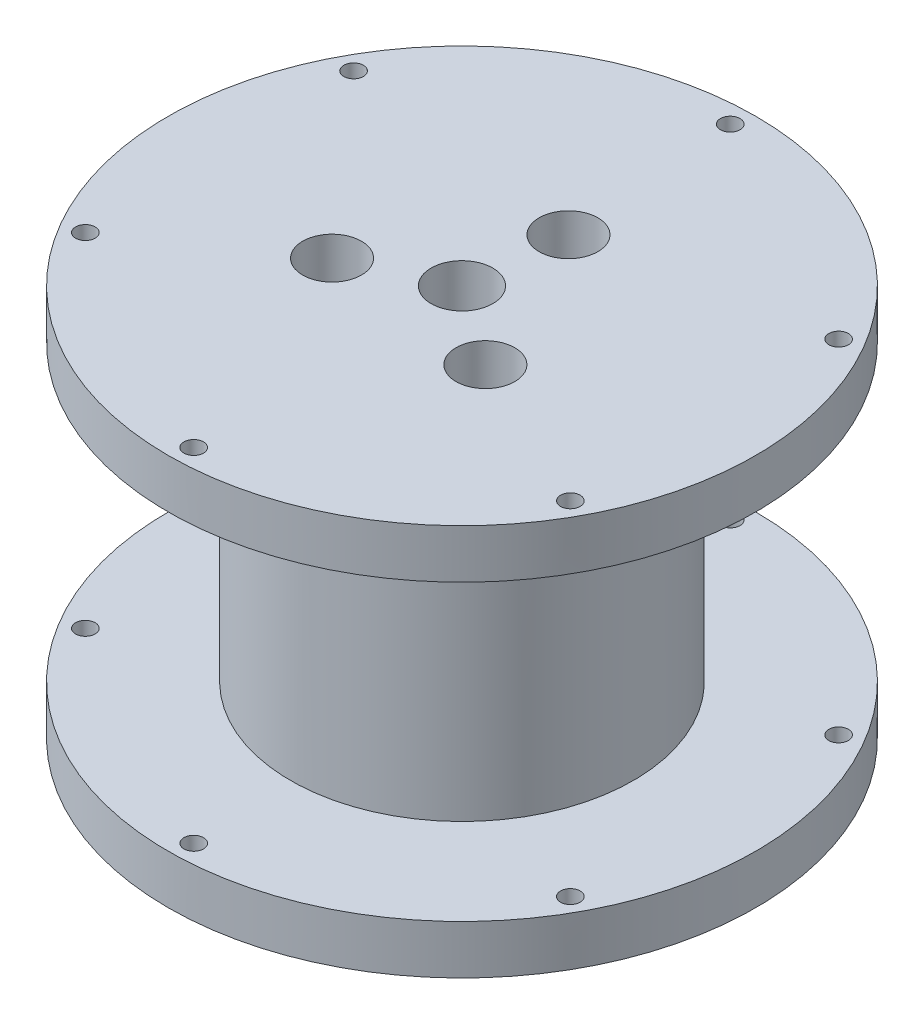
ISO-10303-21;
HEADER;
FILE_DESCRIPTION(('STEP AP214'),'2;1');
FILE_NAME('part.step','',(''),(''),'','','');
FILE_SCHEMA(('AUTOMOTIVE_DESIGN { 1 0 10303 214 1 1 1 1 }'));
ENDSEC;
DATA;
#1=APPLICATION_CONTEXT('core data for automotive mechanical design processes');
#2=APPLICATION_PROTOCOL_DEFINITION('international standard','automotive_design',2000,#1);
#3=PRODUCT_CONTEXT('',#1,'mechanical');
#4=PRODUCT('Part','Part','',(#3));
#5=PRODUCT_RELATED_PRODUCT_CATEGORY('part','',(#4));
#6=PRODUCT_DEFINITION_FORMATION('','',#4);
#7=PRODUCT_DEFINITION_CONTEXT('part definition',#1,'design');
#8=PRODUCT_DEFINITION('design','',#6,#7);
#9=PRODUCT_DEFINITION_SHAPE('','',#8);
#10=(LENGTH_UNIT() NAMED_UNIT(*) SI_UNIT(.MILLI.,.METRE.));
#11=(NAMED_UNIT(*) PLANE_ANGLE_UNIT() SI_UNIT($,.RADIAN.));
#12=(NAMED_UNIT(*) SI_UNIT($,.STERADIAN.) SOLID_ANGLE_UNIT());
#13=UNCERTAINTY_MEASURE_WITH_UNIT(LENGTH_MEASURE(1.E-05),#10,'distance_accuracy_value','');
#14=(GEOMETRIC_REPRESENTATION_CONTEXT(3) GLOBAL_UNCERTAINTY_ASSIGNED_CONTEXT((#13)) GLOBAL_UNIT_ASSIGNED_CONTEXT((#10,
#11,#12)) REPRESENTATION_CONTEXT('',''));
#15=CARTESIAN_POINT('',(0.,0.,0.));
#16=DIRECTION('',(0.,0.,1.));
#17=DIRECTION('',(1.,0.,0.));
#18=AXIS2_PLACEMENT_3D('',#15,#16,#17);
#19=CARTESIAN_POINT('',(0.,40.,0.));
#20=DIRECTION('',(0.,-1.,0.));
#21=DIRECTION('',(0.,0.,-1.));
#22=AXIS2_PLACEMENT_3D('',#19,#20,#21);
#23=CYLINDRICAL_SURFACE('',#22,3.15);
#24=CARTESIAN_POINT('',(0.,40.,0.));
#25=DIRECTION('',(0.,-1.,0.));
#26=DIRECTION('',(0.,0.,-1.));
#27=AXIS2_PLACEMENT_3D('',#24,#25,#26);
#28=CIRCLE('',#27,3.15);
#29=CARTESIAN_POINT('',(0.,40.,-3.15));
#30=VERTEX_POINT('',#29);
#31=EDGE_CURVE('E179',#30,#30,#28,.T.);
#32=ORIENTED_EDGE('',*,*,#31,.F.);
#33=EDGE_LOOP('',(#32));
#34=FACE_BOUND('',#33,.T.);
#35=CARTESIAN_POINT('',(0.,7.5,0.));
#36=DIRECTION('',(0.,-1.,0.));
#37=DIRECTION('',(0.,0.,-1.));
#38=AXIS2_PLACEMENT_3D('',#35,#36,#37);
#39=CIRCLE('',#38,3.15);
#40=CARTESIAN_POINT('',(0.,7.5,-3.15));
#41=VERTEX_POINT('',#40);
#42=EDGE_CURVE('E157',#41,#41,#39,.F.);
#43=ORIENTED_EDGE('',*,*,#42,.F.);
#44=EDGE_LOOP('',(#43));
#45=FACE_BOUND('',#44,.T.);
#46=ADVANCED_FACE('F34',(#34,#45),#23,.F.);
#47=CARTESIAN_POINT('',(0.,40.,0.));
#48=DIRECTION('',(0.,-1.,0.));
#49=DIRECTION('',(0.,0.,-1.));
#50=AXIS2_PLACEMENT_3D('',#47,#48,#49);
#51=CYLINDRICAL_SURFACE('',#50,30.);
#52=CARTESIAN_POINT('',(0.,40.,0.));
#53=DIRECTION('',(0.,1.,0.));
#54=DIRECTION('',(0.,0.,1.));
#55=AXIS2_PLACEMENT_3D('',#52,#53,#54);
#56=CIRCLE('',#55,30.);
#57=CARTESIAN_POINT('',(0.,40.,30.));
#58=VERTEX_POINT('',#57);
#59=EDGE_CURVE('E203',#58,#58,#56,.T.);
#60=ORIENTED_EDGE('',*,*,#59,.F.);
#61=EDGE_LOOP('',(#60));
#62=FACE_BOUND('',#61,.T.);
#63=CARTESIAN_POINT('',(0.,35.,0.));
#64=DIRECTION('',(0.,-1.,0.));
#65=DIRECTION('',(0.,0.,-1.));
#66=AXIS2_PLACEMENT_3D('',#63,#64,#65);
#67=CIRCLE('',#66,30.);
#68=CARTESIAN_POINT('',(0.,35.,-30.));
#69=VERTEX_POINT('',#68);
#70=EDGE_CURVE('E210',#69,#69,#67,.T.);
#71=ORIENTED_EDGE('',*,*,#70,.F.);
#72=EDGE_LOOP('',(#71));
#73=FACE_BOUND('',#72,.T.);
#74=ADVANCED_FACE('F247',(#62,#73),#51,.T.);
#75=CARTESIAN_POINT('',(0.,40.,0.));
#76=DIRECTION('',(0.,1.,0.));
#77=DIRECTION('',(0.,0.,1.));
#78=AXIS2_PLACEMENT_3D('',#75,#76,#77);
#79=PLANE('',#78);
#80=CARTESIAN_POINT('',(23.9426736674736,40.,-14.517175264247));
#81=DIRECTION('',(0.,-1.,0.));
#82=DIRECTION('',(0.,0.,-1.));
#83=AXIS2_PLACEMENT_3D('',#80,#81,#82);
#84=CIRCLE('',#83,1.);
#85=CARTESIAN_POINT('',(23.9426736674736,40.,-15.517175264247));
#86=VERTEX_POINT('',#85);
#87=EDGE_CURVE('E497',#86,#86,#84,.T.);
#88=ORIENTED_EDGE('',*,*,#87,.T.);
#89=EDGE_LOOP('',(#88));
#90=FACE_BOUND('',#89,.T.);
#91=CARTESIAN_POINT('',(-0.600905736292166,40.,-27.9935512626764));
#92=DIRECTION('',(0.,-1.,0.));
#93=DIRECTION('',(0.,0.,-1.));
#94=AXIS2_PLACEMENT_3D('',#91,#92,#93);
#95=CIRCLE('',#94,1.);
#96=CARTESIAN_POINT('',(-0.600905736292166,40.,-28.9935512626764));
#97=VERTEX_POINT('',#96);
#98=EDGE_CURVE('E498',#97,#97,#95,.T.);
#99=ORIENTED_EDGE('',*,*,#98,.T.);
#100=EDGE_LOOP('',(#99));
#101=FACE_BOUND('',#100,.T.);
#102=CARTESIAN_POINT('',(-24.5435794037658,40.,-13.4763759984294));
#103=DIRECTION('',(0.,-1.,0.));
#104=DIRECTION('',(0.,0.,-1.));
#105=AXIS2_PLACEMENT_3D('',#102,#103,#104);
#106=CIRCLE('',#105,1.);
#107=CARTESIAN_POINT('',(-24.5435794037658,40.,-14.4763759984294));
#108=VERTEX_POINT('',#107);
#109=EDGE_CURVE('E501',#108,#108,#106,.T.);
#110=ORIENTED_EDGE('',*,*,#109,.T.);
#111=EDGE_LOOP('',(#110));
#112=FACE_BOUND('',#111,.T.);
#113=CARTESIAN_POINT('',(-23.9426736674736,40.,14.517175264247));
#114=DIRECTION('',(0.,-1.,0.));
#115=DIRECTION('',(0.,0.,-1.));
#116=AXIS2_PLACEMENT_3D('',#113,#114,#115);
#117=CIRCLE('',#116,1.);
#118=CARTESIAN_POINT('',(-23.9426736674736,40.,13.517175264247));
#119=VERTEX_POINT('',#118);
#120=EDGE_CURVE('E624',#119,#119,#117,.T.);
#121=ORIENTED_EDGE('',*,*,#120,.T.);
#122=EDGE_LOOP('',(#121));
#123=FACE_BOUND('',#122,.T.);
#124=CARTESIAN_POINT('',(0.600905736292153,40.,27.9935512626764));
#125=DIRECTION('',(0.,-1.,0.));
#126=DIRECTION('',(0.,0.,-1.));
#127=AXIS2_PLACEMENT_3D('',#124,#125,#126);
#128=CIRCLE('',#127,1.);
#129=CARTESIAN_POINT('',(0.600905736292153,40.,26.9935512626764));
#130=VERTEX_POINT('',#129);
#131=EDGE_CURVE('E509',#130,#130,#128,.T.);
#132=ORIENTED_EDGE('',*,*,#131,.T.);
#133=EDGE_LOOP('',(#132));
#134=FACE_BOUND('',#133,.T.);
#135=CARTESIAN_POINT('',(24.5435794037658,40.,13.4763759984294));
#136=DIRECTION('',(0.,-1.,0.));
#137=DIRECTION('',(0.,0.,-1.));
#138=AXIS2_PLACEMENT_3D('',#135,#136,#137);
#139=CIRCLE('',#138,1.);
#140=CARTESIAN_POINT('',(24.5435794037658,40.,12.4763759984294));
#141=VERTEX_POINT('',#140);
#142=EDGE_CURVE('E505',#141,#141,#139,.T.);
#143=ORIENTED_EDGE('',*,*,#142,.T.);
#144=EDGE_LOOP('',(#143));
#145=FACE_BOUND('',#144,.T.);
#146=CARTESIAN_POINT('',(0.91840979877331,40.,-9.95773686344027));
#147=DIRECTION('',(0.,-1.,0.));
#148=DIRECTION('',(0.,0.,-1.));
#149=AXIS2_PLACEMENT_3D('',#146,#147,#148);
#150=CIRCLE('',#149,3.);
#151=CARTESIAN_POINT('',(0.91840979877331,40.,-12.9577368634403));
#152=VERTEX_POINT('',#151);
#153=EDGE_CURVE('E176',#152,#152,#150,.T.);
#154=ORIENTED_EDGE('',*,*,#153,.T.);
#155=EDGE_LOOP('',(#154));
#156=FACE_BOUND('',#155,.T.);
#157=CARTESIAN_POINT('',(8.1644481885534,40.,5.77423464854237));
#158=DIRECTION('',(0.,-1.,0.));
#159=DIRECTION('',(0.,0.,-1.));
#160=AXIS2_PLACEMENT_3D('',#157,#158,#159);
#161=CIRCLE('',#160,3.);
#162=CARTESIAN_POINT('',(8.1644481885534,40.,2.77423464854237));
#163=VERTEX_POINT('',#162);
#164=EDGE_CURVE('E183',#163,#163,#161,.T.);
#165=ORIENTED_EDGE('',*,*,#164,.T.);
#166=EDGE_LOOP('',(#165));
#167=FACE_BOUND('',#166,.T.);
#168=CARTESIAN_POINT('',(-9.0828579873267,40.,4.1835022148979));
#169=DIRECTION('',(0.,-1.,0.));
#170=DIRECTION('',(0.,0.,-1.));
#171=AXIS2_PLACEMENT_3D('',#168,#169,#170);
#172=CIRCLE('',#171,3.);
#173=CARTESIAN_POINT('',(-9.0828579873267,40.,1.1835022148979));
#174=VERTEX_POINT('',#173);
#175=EDGE_CURVE('E189',#174,#174,#172,.T.);
#176=ORIENTED_EDGE('',*,*,#175,.T.);
#177=EDGE_LOOP('',(#176));
#178=FACE_BOUND('',#177,.T.);
#179=ORIENTED_EDGE('',*,*,#31,.T.);
#180=EDGE_LOOP('',(#179));
#181=FACE_BOUND('',#180,.T.);
#182=ORIENTED_EDGE('',*,*,#59,.T.);
#183=EDGE_LOOP('',(#182));
#184=FACE_BOUND('',#183,.T.);
#185=ADVANCED_FACE('F240',(#90,#101,#112,#123,#134,#145,#156,#167,#178,#181,#184),#79,.T.);
#186=CARTESIAN_POINT('',(0.,35.,0.));
#187=DIRECTION('',(0.,-1.,0.));
#188=DIRECTION('',(0.,0.,-1.));
#189=AXIS2_PLACEMENT_3D('',#186,#187,#188);
#190=PLANE('',#189);
#191=CARTESIAN_POINT('',(23.9426736674736,35.,-14.517175264247));
#192=DIRECTION('',(0.,-1.,0.));
#193=DIRECTION('',(0.,0.,-1.));
#194=AXIS2_PLACEMENT_3D('',#191,#192,#193);
#195=CIRCLE('',#194,1.);
#196=CARTESIAN_POINT('',(23.9426736674736,35.,-15.517175264247));
#197=VERTEX_POINT('',#196);
#198=EDGE_CURVE('E134',#197,#197,#195,.T.);
#199=ORIENTED_EDGE('',*,*,#198,.F.);
#200=EDGE_LOOP('',(#199));
#201=FACE_BOUND('',#200,.T.);
#202=CARTESIAN_POINT('',(-0.600905736292166,35.,-27.9935512626764));
#203=DIRECTION('',(0.,-1.,0.));
#204=DIRECTION('',(0.,0.,-1.));
#205=AXIS2_PLACEMENT_3D('',#202,#203,#204);
#206=CIRCLE('',#205,1.);
#207=CARTESIAN_POINT('',(-0.600905736292166,35.,-28.9935512626764));
#208=VERTEX_POINT('',#207);
#209=EDGE_CURVE('E541',#208,#208,#206,.T.);
#210=ORIENTED_EDGE('',*,*,#209,.F.);
#211=EDGE_LOOP('',(#210));
#212=FACE_BOUND('',#211,.T.);
#213=CARTESIAN_POINT('',(-24.5435794037658,35.,-13.4763759984294));
#214=DIRECTION('',(0.,-1.,0.));
#215=DIRECTION('',(0.,0.,-1.));
#216=AXIS2_PLACEMENT_3D('',#213,#214,#215);
#217=CIRCLE('',#216,1.);
#218=CARTESIAN_POINT('',(-24.5435794037658,35.,-14.4763759984294));
#219=VERTEX_POINT('',#218);
#220=EDGE_CURVE('E534',#219,#219,#217,.T.);
#221=ORIENTED_EDGE('',*,*,#220,.F.);
#222=EDGE_LOOP('',(#221));
#223=FACE_BOUND('',#222,.T.);
#224=CARTESIAN_POINT('',(-23.9426736674736,35.,14.517175264247));
#225=DIRECTION('',(0.,-1.,0.));
#226=DIRECTION('',(0.,0.,-1.));
#227=AXIS2_PLACEMENT_3D('',#224,#225,#226);
#228=CIRCLE('',#227,1.);
#229=CARTESIAN_POINT('',(-23.9426736674736,35.,13.517175264247));
#230=VERTEX_POINT('',#229);
#231=EDGE_CURVE('E527',#230,#230,#228,.T.);
#232=ORIENTED_EDGE('',*,*,#231,.F.);
#233=EDGE_LOOP('',(#232));
#234=FACE_BOUND('',#233,.T.);
#235=CARTESIAN_POINT('',(0.600905736292153,35.,27.9935512626764));
#236=DIRECTION('',(0.,-1.,0.));
#237=DIRECTION('',(0.,0.,-1.));
#238=AXIS2_PLACEMENT_3D('',#235,#236,#237);
#239=CIRCLE('',#238,1.);
#240=CARTESIAN_POINT('',(0.600905736292153,35.,26.9935512626764));
#241=VERTEX_POINT('',#240);
#242=EDGE_CURVE('E520',#241,#241,#239,.T.);
#243=ORIENTED_EDGE('',*,*,#242,.F.);
#244=EDGE_LOOP('',(#243));
#245=FACE_BOUND('',#244,.T.);
#246=CARTESIAN_POINT('',(24.5435794037658,35.,13.4763759984294));
#247=DIRECTION('',(0.,-1.,0.));
#248=DIRECTION('',(0.,0.,-1.));
#249=AXIS2_PLACEMENT_3D('',#246,#247,#248);
#250=CIRCLE('',#249,1.);
#251=CARTESIAN_POINT('',(24.5435794037658,35.,12.4763759984294));
#252=VERTEX_POINT('',#251);
#253=EDGE_CURVE('E513',#252,#252,#250,.T.);
#254=ORIENTED_EDGE('',*,*,#253,.F.);
#255=EDGE_LOOP('',(#254));
#256=FACE_BOUND('',#255,.T.);
#257=CARTESIAN_POINT('',(0.,35.,0.));
#258=DIRECTION('',(0.,-1.,0.));
#259=DIRECTION('',(0.,0.,-1.));
#260=AXIS2_PLACEMENT_3D('',#257,#258,#259);
#261=CIRCLE('',#260,17.5);
#262=CARTESIAN_POINT('',(0.,35.,-17.5));
#263=VERTEX_POINT('',#262);
#264=EDGE_CURVE('E197',#263,#263,#261,.T.);
#265=ORIENTED_EDGE('',*,*,#264,.F.);
#266=EDGE_LOOP('',(#265));
#267=FACE_BOUND('',#266,.T.);
#268=ORIENTED_EDGE('',*,*,#70,.T.);
#269=EDGE_LOOP('',(#268));
#270=FACE_BOUND('',#269,.T.);
#271=ADVANCED_FACE('F236',(#201,#212,#223,#234,#245,#256,#267,#270),#190,.T.);
#272=CARTESIAN_POINT('',(0.,5.,0.));
#273=DIRECTION('',(0.,-1.,0.));
#274=DIRECTION('',(0.,0.,-1.));
#275=AXIS2_PLACEMENT_3D('',#272,#273,#274);
#276=PLANE('',#275);
#277=CARTESIAN_POINT('',(23.9426736674736,5.,-14.517175264247));
#278=DIRECTION('',(0.,-1.,0.));
#279=DIRECTION('',(0.,0.,-1.));
#280=AXIS2_PLACEMENT_3D('',#277,#278,#279);
#281=CIRCLE('',#280,1.);
#282=CARTESIAN_POINT('',(23.9426736674736,5.,-15.517175264247));
#283=VERTEX_POINT('',#282);
#284=EDGE_CURVE('E543',#283,#283,#281,.T.);
#285=ORIENTED_EDGE('',*,*,#284,.T.);
#286=EDGE_LOOP('',(#285));
#287=FACE_BOUND('',#286,.T.);
#288=CARTESIAN_POINT('',(-0.600905736292166,5.,-27.9935512626764));
#289=DIRECTION('',(0.,-1.,0.));
#290=DIRECTION('',(0.,0.,-1.));
#291=AXIS2_PLACEMENT_3D('',#288,#289,#290);
#292=CIRCLE('',#291,1.);
#293=CARTESIAN_POINT('',(-0.600905736292166,5.,-28.9935512626764));
#294=VERTEX_POINT('',#293);
#295=EDGE_CURVE('E538',#294,#294,#292,.T.);
#296=ORIENTED_EDGE('',*,*,#295,.T.);
#297=EDGE_LOOP('',(#296));
#298=FACE_BOUND('',#297,.T.);
#299=CARTESIAN_POINT('',(-24.5435794037658,5.,-13.4763759984294));
#300=DIRECTION('',(0.,-1.,0.));
#301=DIRECTION('',(0.,0.,-1.));
#302=AXIS2_PLACEMENT_3D('',#299,#300,#301);
#303=CIRCLE('',#302,1.);
#304=CARTESIAN_POINT('',(-24.5435794037658,5.,-14.4763759984294));
#305=VERTEX_POINT('',#304);
#306=EDGE_CURVE('E531',#305,#305,#303,.T.);
#307=ORIENTED_EDGE('',*,*,#306,.T.);
#308=EDGE_LOOP('',(#307));
#309=FACE_BOUND('',#308,.T.);
#310=CARTESIAN_POINT('',(-23.9426736674736,5.,14.517175264247));
#311=DIRECTION('',(0.,-1.,0.));
#312=DIRECTION('',(0.,0.,-1.));
#313=AXIS2_PLACEMENT_3D('',#310,#311,#312);
#314=CIRCLE('',#313,1.);
#315=CARTESIAN_POINT('',(-23.9426736674736,5.,13.517175264247));
#316=VERTEX_POINT('',#315);
#317=EDGE_CURVE('E524',#316,#316,#314,.T.);
#318=ORIENTED_EDGE('',*,*,#317,.T.);
#319=EDGE_LOOP('',(#318));
#320=FACE_BOUND('',#319,.T.);
#321=CARTESIAN_POINT('',(0.600905736292153,5.,27.9935512626764));
#322=DIRECTION('',(0.,-1.,0.));
#323=DIRECTION('',(0.,0.,-1.));
#324=AXIS2_PLACEMENT_3D('',#321,#322,#323);
#325=CIRCLE('',#324,1.);
#326=CARTESIAN_POINT('',(0.600905736292153,5.,26.9935512626764));
#327=VERTEX_POINT('',#326);
#328=EDGE_CURVE('E517',#327,#327,#325,.T.);
#329=ORIENTED_EDGE('',*,*,#328,.T.);
#330=EDGE_LOOP('',(#329));
#331=FACE_BOUND('',#330,.T.);
#332=CARTESIAN_POINT('',(24.5435794037658,5.,13.4763759984294));
#333=DIRECTION('',(0.,-1.,0.));
#334=DIRECTION('',(0.,0.,-1.));
#335=AXIS2_PLACEMENT_3D('',#332,#333,#334);
#336=CIRCLE('',#335,1.);
#337=CARTESIAN_POINT('',(24.5435794037658,5.,12.4763759984294));
#338=VERTEX_POINT('',#337);
#339=EDGE_CURVE('E510',#338,#338,#336,.T.);
#340=ORIENTED_EDGE('',*,*,#339,.T.);
#341=EDGE_LOOP('',(#340));
#342=FACE_BOUND('',#341,.T.);
#343=CARTESIAN_POINT('',(0.,5.,0.));
#344=DIRECTION('',(0.,-1.,0.));
#345=DIRECTION('',(0.,0.,-1.));
#346=AXIS2_PLACEMENT_3D('',#343,#344,#345);
#347=CIRCLE('',#346,17.5);
#348=CARTESIAN_POINT('',(-14.2785338407005,5.,-10.1179776319169));
#349=VERTEX_POINT('',#348);
#350=CARTESIAN_POINT('',(-16.2005846637719,5.,-6.61748113347961));
#351=VERTEX_POINT('',#350);
#352=EDGE_CURVE('E196',#349,#351,#347,.T.);
#353=ORIENTED_EDGE('',*,*,#352,.T.);
#354=CARTESIAN_POINT('',(-15.3397371273536,5.,-8.42273499901836));
#355=DIRECTION('',(0.,-1.,0.));
#356=DIRECTION('',(0.,0.,-1.));
#357=AXIS2_PLACEMENT_3D('',#354,#355,#356);
#358=CIRCLE('',#357,2.);
#359=EDGE_CURVE('E172',#349,#351,#358,.F.);
#360=ORIENTED_EDGE('',*,*,#359,.F.);
#361=EDGE_LOOP('',(#353,#360));
#362=FACE_BOUND('',#361,.T.);
#363=CARTESIAN_POINT('',(0.,5.,0.));
#364=DIRECTION('',(0.,-1.,0.));
#365=DIRECTION('',(0.,0.,-1.));
#366=AXIS2_PLACEMENT_3D('',#363,#364,#365);
#367=CIRCLE('',#366,30.);
#368=CARTESIAN_POINT('',(0.,5.,-30.));
#369=VERTEX_POINT('',#368);
#370=EDGE_CURVE('E200',#369,#369,#367,.T.);
#371=ORIENTED_EDGE('',*,*,#370,.F.);
#372=EDGE_LOOP('',(#371));
#373=FACE_BOUND('',#372,.T.);
#374=ADVANCED_FACE('F234',(#287,#298,#309,#320,#331,#342,#362,#373),#276,.F.);
#375=CARTESIAN_POINT('',(0.,35.,0.));
#376=DIRECTION('',(0.,-1.,0.));
#377=DIRECTION('',(0.,0.,-1.));
#378=AXIS2_PLACEMENT_3D('',#375,#376,#377);
#379=CYLINDRICAL_SURFACE('',#378,17.5);
#380=DIRECTION('',(0.,-1.,0.));
#381=VECTOR('',#380,1.);
#382=CARTESIAN_POINT('',(-14.2785338407005,20.,-10.1179776319169));
#383=LINE('',#382,#381);
#384=CARTESIAN_POINT('',(-14.2785338407005,6.,-10.1179776319169));
#385=VERTEX_POINT('',#384);
#386=EDGE_CURVE('E167',#349,#385,#383,.F.);
#387=ORIENTED_EDGE('',*,*,#386,.T.);
#388=CARTESIAN_POINT('',(-14.2785338407005,6.,-10.1179776319169));
#389=CARTESIAN_POINT('',(-14.2785327253716,6.0562194883411,-10.1179765012855));
#390=CARTESIAN_POINT('',(-14.2799076295418,6.11241199955088,-10.1160392382119));
#391=CARTESIAN_POINT('',(-14.2853839994859,6.22439403919385,-10.1083053532598));
#392=CARTESIAN_POINT('',(-14.2894853182556,6.28018358919015,-10.1025089394607));
#393=CARTESIAN_POINT('',(-14.3058222436855,6.44624370070353,-10.0793764439415));
#394=CARTESIAN_POINT('',(-14.3220910053981,6.55540055311681,-10.0562969940414));
#395=CARTESIAN_POINT('',(-14.3647097202837,6.76742009712747,-9.99532299312393));
#396=CARTESIAN_POINT('',(-14.391064279592,6.87027988795344,-9.95742167285623));
#397=CARTESIAN_POINT('',(-14.4527574944918,7.06680087859013,-9.86766207144121));
#398=CARTESIAN_POINT('',(-14.4880947788519,7.16046347934816,-9.81580592045649));
#399=CARTESIAN_POINT('',(-14.5663566188937,7.3360168170633,-9.69928705794387));
#400=CARTESIAN_POINT('',(-14.6092872219855,7.41789807625467,-9.63461413400259));
#401=CARTESIAN_POINT('',(-14.701045031153,7.56750609083921,-9.49401423308429));
#402=CARTESIAN_POINT('',(-14.7498733400795,7.63523019240694,-9.41808515063888));
#403=CARTESIAN_POINT('',(-14.8515616068764,7.75456443867903,-9.25689942999778));
#404=CARTESIAN_POINT('',(-14.9044203446804,7.80617943592353,-9.17164561115962));
#405=CARTESIAN_POINT('',(-15.0122848629163,7.89183553562339,-8.99400190153066));
#406=CARTESIAN_POINT('',(-15.0672893259959,7.9258872438194,-8.90161635613762));
#407=CARTESIAN_POINT('',(-15.1588619995994,7.96706730201505,-8.74437871457755));
#408=CARTESIAN_POINT('',(-15.195362587963,7.97940866856579,-8.68080301173116));
#409=CARTESIAN_POINT('',(-15.2679571196282,7.99587444308896,-8.55248315926871));
#410=CARTESIAN_POINT('',(-15.304051544361,8.00000989445048,-8.48774069849978));
#411=CARTESIAN_POINT('',(-15.3397371273536,8.,-8.42273499901836));
#412=B_SPLINE_CURVE_WITH_KNOTS('',3,(#388,#389,#390,#391,#392,#393,#394,#395,#396,#397,#398,
#399,#400,#401,#402,#403,#404,#405,#406,#407,#408,#409,#410,#411),.UNSPECIFIED.,.F.,.F.,(4,2,2,
2,2,2,2,2,2,2,2,4),(0.,0.16855473112019,0.337100374764693,0.673614622449847,1.01028273833459,
1.34689949197511,1.68378554835441,2.02073469908359,2.35758225254909,2.6942261589239,
2.91681308961449,3.13910026266834),.UNSPECIFIED.);
#413=CARTESIAN_POINT('',(-15.3397371273536,8.,-8.42273499901836));
#414=VERTEX_POINT('',#413);
#415=EDGE_CURVE('E44',#385,#414,#412,.T.);
#416=ORIENTED_EDGE('',*,*,#415,.T.);
#417=CARTESIAN_POINT('',(-15.3397371273536,8.,-8.42273499901836));
#418=CARTESIAN_POINT('',(-15.3666892958916,7.99999964414278,-8.37365200479563));
#419=CARTESIAN_POINT('',(-15.3933900093695,7.99764685831645,-8.32446164689033));
#420=CARTESIAN_POINT('',(-15.4461346697476,7.98826078304028,-8.22617935480664));
#421=CARTESIAN_POINT('',(-15.4721786560741,7.98122777526309,-8.17708741488343));
#422=CARTESIAN_POINT('',(-15.5490072452259,7.95317824067768,-8.0305960821633));
#423=CARTESIAN_POINT('',(-15.5985866451037,7.92521099671269,-7.93380215917815));
#424=CARTESIAN_POINT('',(-15.6932391682437,7.85151690268498,-7.74489795589235));
#425=CARTESIAN_POINT('',(-15.7383103611693,7.80578248561243,-7.65278969013413));
#426=CARTESIAN_POINT('',(-15.8230375113524,7.69784791607021,-7.47603447002288));
#427=CARTESIAN_POINT('',(-15.8626941579339,7.63564986254905,-7.39138656638092));
#428=CARTESIAN_POINT('',(-15.9360015932217,7.49638057865078,-7.23198338175992));
#429=CARTESIAN_POINT('',(-15.9696389629215,7.41927689482479,-7.15725029780035));
#430=CARTESIAN_POINT('',(-16.0303494413699,7.25243317085377,-7.02022275394354));
#431=CARTESIAN_POINT('',(-16.0574212766379,7.16269068455681,-6.95793070757913));
#432=CARTESIAN_POINT('',(-16.1047674521599,6.97284990320016,-6.84763397767562));
#433=CARTESIAN_POINT('',(-16.1250226656271,6.87272348343563,-6.79966953766044));
#434=CARTESIAN_POINT('',(-16.1584567854848,6.66516766654066,-6.71983320898704));
#435=CARTESIAN_POINT('',(-16.1716396391145,6.55774238086806,-6.68795234432661));
#436=CARTESIAN_POINT('',(-16.1876936289706,6.3747560162437,-6.64897453266134));
#437=CARTESIAN_POINT('',(-16.1925299341713,6.30032854168021,-6.63717556467603));
#438=CARTESIAN_POINT('',(-16.1989726240992,6.15061109168183,-6.62142776143091));
#439=CARTESIAN_POINT('',(-16.2005833345293,6.0753224077179,-6.61746841288403));
#440=CARTESIAN_POINT('',(-16.2005846637719,6.,-6.61748113347962));
#441=B_SPLINE_CURVE_WITH_KNOTS('',3,(#417,#418,#419,#420,#421,#422,#423,#424,#425,#426,#427,
#428,#429,#430,#431,#432,#433,#434,#435,#436,#437,#438,#439,#440),.UNSPECIFIED.,.F.,.F.,(4,2,2,
2,2,2,2,2,2,2,2,4),(0.,0.167884729659221,0.335759356323115,0.67090392766453,1.00619139328893,
1.34143613369577,1.6774191817537,2.01346734657707,2.35045071818943,2.68724581581267,
2.91332989232799,3.13911057388865),.UNSPECIFIED.);
#442=CARTESIAN_POINT('',(-16.2005846637719,6.,-6.61748113347961));
#443=VERTEX_POINT('',#442);
#444=EDGE_CURVE('E12',#414,#443,#441,.T.);
#445=ORIENTED_EDGE('',*,*,#444,.T.);
#446=DIRECTION('',(0.,-1.,0.));
#447=VECTOR('',#446,1.);
#448=CARTESIAN_POINT('',(-16.2005846637719,20.,-6.61748113347961));
#449=LINE('',#448,#447);
#450=EDGE_CURVE('E165',#443,#351,#449,.T.);
#451=ORIENTED_EDGE('',*,*,#450,.T.);
#452=ORIENTED_EDGE('',*,*,#352,.F.);
#453=EDGE_LOOP('',(#387,#416,#445,#451,#452));
#454=FACE_BOUND('',#453,.T.);
#455=ORIENTED_EDGE('',*,*,#264,.T.);
#456=EDGE_LOOP('',(#455));
#457=FACE_BOUND('',#456,.T.);
#458=ADVANCED_FACE('F228',(#454,#457),#379,.T.);
#459=CARTESIAN_POINT('',(0.,0.,0.));
#460=DIRECTION('',(0.,1.,0.));
#461=DIRECTION('',(0.,0.,1.));
#462=AXIS2_PLACEMENT_3D('',#459,#460,#461);
#463=PLANE('',#462);
#464=CARTESIAN_POINT('',(23.9426736674736,0.,-14.517175264247));
#465=DIRECTION('',(0.,1.,0.));
#466=DIRECTION('',(0.,0.,1.));
#467=AXIS2_PLACEMENT_3D('',#464,#465,#466);
#468=CIRCLE('',#467,1.);
#469=CARTESIAN_POINT('',(23.9426736674736,0.,-13.517175264247));
#470=VERTEX_POINT('',#469);
#471=EDGE_CURVE('E39',#470,#470,#468,.T.);
#472=ORIENTED_EDGE('',*,*,#471,.T.);
#473=EDGE_LOOP('',(#472));
#474=FACE_BOUND('',#473,.T.);
#475=CARTESIAN_POINT('',(-0.600905736292166,0.,-27.9935512626764));
#476=DIRECTION('',(0.,1.,0.));
#477=DIRECTION('',(0.,0.,1.));
#478=AXIS2_PLACEMENT_3D('',#475,#476,#477);
#479=CIRCLE('',#478,1.);
#480=CARTESIAN_POINT('',(-0.600905736292166,0.,-26.9935512626764));
#481=VERTEX_POINT('',#480);
#482=EDGE_CURVE('E537',#481,#481,#479,.T.);
#483=ORIENTED_EDGE('',*,*,#482,.T.);
#484=EDGE_LOOP('',(#483));
#485=FACE_BOUND('',#484,.T.);
#486=CARTESIAN_POINT('',(-24.5435794037658,0.,-13.4763759984294));
#487=DIRECTION('',(0.,1.,0.));
#488=DIRECTION('',(0.,0.,1.));
#489=AXIS2_PLACEMENT_3D('',#486,#487,#488);
#490=CIRCLE('',#489,1.);
#491=CARTESIAN_POINT('',(-24.5435794037658,0.,-12.4763759984294));
#492=VERTEX_POINT('',#491);
#493=EDGE_CURVE('E530',#492,#492,#490,.T.);
#494=ORIENTED_EDGE('',*,*,#493,.T.);
#495=EDGE_LOOP('',(#494));
#496=FACE_BOUND('',#495,.T.);
#497=CARTESIAN_POINT('',(-23.9426736674736,0.,14.517175264247));
#498=DIRECTION('',(0.,1.,0.));
#499=DIRECTION('',(0.,0.,1.));
#500=AXIS2_PLACEMENT_3D('',#497,#498,#499);
#501=CIRCLE('',#500,1.);
#502=CARTESIAN_POINT('',(-23.9426736674736,0.,15.517175264247));
#503=VERTEX_POINT('',#502);
#504=EDGE_CURVE('E523',#503,#503,#501,.T.);
#505=ORIENTED_EDGE('',*,*,#504,.T.);
#506=EDGE_LOOP('',(#505));
#507=FACE_BOUND('',#506,.T.);
#508=CARTESIAN_POINT('',(0.600905736292153,0.,27.9935512626764));
#509=DIRECTION('',(0.,1.,0.));
#510=DIRECTION('',(0.,0.,1.));
#511=AXIS2_PLACEMENT_3D('',#508,#509,#510);
#512=CIRCLE('',#511,1.);
#513=CARTESIAN_POINT('',(0.600905736292153,0.,28.9935512626764));
#514=VERTEX_POINT('',#513);
#515=EDGE_CURVE('E516',#514,#514,#512,.T.);
#516=ORIENTED_EDGE('',*,*,#515,.T.);
#517=EDGE_LOOP('',(#516));
#518=FACE_BOUND('',#517,.T.);
#519=CARTESIAN_POINT('',(24.5435794037658,0.,13.4763759984294));
#520=DIRECTION('',(0.,1.,0.));
#521=DIRECTION('',(0.,0.,1.));
#522=AXIS2_PLACEMENT_3D('',#519,#520,#521);
#523=CIRCLE('',#522,1.);
#524=CARTESIAN_POINT('',(24.5435794037658,0.,14.4763759984294));
#525=VERTEX_POINT('',#524);
#526=EDGE_CURVE('E508',#525,#525,#523,.T.);
#527=ORIENTED_EDGE('',*,*,#526,.T.);
#528=EDGE_LOOP('',(#527));
#529=FACE_BOUND('',#528,.T.);
#530=DIRECTION('',(0.5,0.,-0.866025403784439));
#531=VECTOR('',#530,1.);
#532=CARTESIAN_POINT('',(-6.06217782649107,0.,0.));
#533=LINE('',#532,#531);
#534=CARTESIAN_POINT('',(-6.06217782649107,0.,0.));
#535=VERTEX_POINT('',#534);
#536=CARTESIAN_POINT('',(-3.03108891324554,0.,-5.25));
#537=VERTEX_POINT('',#536);
#538=EDGE_CURVE('E145',#535,#537,#533,.T.);
#539=ORIENTED_EDGE('',*,*,#538,.F.);
#540=DIRECTION('',(-0.5,0.,-0.866025403784438));
#541=VECTOR('',#540,1.);
#542=CARTESIAN_POINT('',(-3.03108891324554,0.,5.25));
#543=LINE('',#542,#541);
#544=CARTESIAN_POINT('',(-3.03108891324554,0.,5.25));
#545=VERTEX_POINT('',#544);
#546=EDGE_CURVE('E109',#545,#535,#543,.T.);
#547=ORIENTED_EDGE('',*,*,#546,.F.);
#548=DIRECTION('',(-1.,0.,0.));
#549=VECTOR('',#548,1.);
#550=CARTESIAN_POINT('',(3.03108891324554,0.,5.25));
#551=LINE('',#550,#549);
#552=CARTESIAN_POINT('',(3.03108891324554,0.,5.25));
#553=VERTEX_POINT('',#552);
#554=EDGE_CURVE('E128',#553,#545,#551,.T.);
#555=ORIENTED_EDGE('',*,*,#554,.F.);
#556=DIRECTION('',(-0.5,0.,0.866025403784439));
#557=VECTOR('',#556,1.);
#558=CARTESIAN_POINT('',(6.06217782649107,0.,0.));
#559=LINE('',#558,#557);
#560=CARTESIAN_POINT('',(6.06217782649107,0.,0.));
#561=VERTEX_POINT('',#560);
#562=EDGE_CURVE('E131',#561,#553,#559,.T.);
#563=ORIENTED_EDGE('',*,*,#562,.F.);
#564=DIRECTION('',(0.5,0.,0.866025403784439));
#565=VECTOR('',#564,1.);
#566=CARTESIAN_POINT('',(3.03108891324554,0.,-5.25));
#567=LINE('',#566,#565);
#568=CARTESIAN_POINT('',(3.03108891324554,0.,-5.25));
#569=VERTEX_POINT('',#568);
#570=EDGE_CURVE('E150',#569,#561,#567,.T.);
#571=ORIENTED_EDGE('',*,*,#570,.F.);
#572=DIRECTION('',(1.,0.,0.));
#573=VECTOR('',#572,1.);
#574=CARTESIAN_POINT('',(-3.03108891324554,0.,-5.25));
#575=LINE('',#574,#573);
#576=EDGE_CURVE('E147',#537,#569,#575,.T.);
#577=ORIENTED_EDGE('',*,*,#576,.F.);
#578=EDGE_LOOP('',(#539,#547,#555,#563,#571,#577));
#579=FACE_BOUND('',#578,.T.);
#580=CARTESIAN_POINT('',(-15.3397371273536,0.,-8.42273499901836));
#581=DIRECTION('',(0.,1.,0.));
#582=DIRECTION('',(0.,0.,1.));
#583=AXIS2_PLACEMENT_3D('',#580,#581,#582);
#584=CIRCLE('',#583,2.);
#585=CARTESIAN_POINT('',(-15.3397371273536,0.,-6.42273499901836));
#586=VERTEX_POINT('',#585);
#587=EDGE_CURVE('E169',#586,#586,#584,.F.);
#588=ORIENTED_EDGE('',*,*,#587,.F.);
#589=EDGE_LOOP('',(#588));
#590=FACE_BOUND('',#589,.T.);
#591=CARTESIAN_POINT('',(0.91840979877331,0.,-9.95773686344027));
#592=DIRECTION('',(0.,-1.,0.));
#593=DIRECTION('',(0.,0.,-1.));
#594=AXIS2_PLACEMENT_3D('',#591,#592,#593);
#595=CIRCLE('',#594,3.);
#596=CARTESIAN_POINT('',(0.91840979877331,0.,-12.9577368634403));
#597=VERTEX_POINT('',#596);
#598=EDGE_CURVE('E180',#597,#597,#595,.T.);
#599=ORIENTED_EDGE('',*,*,#598,.F.);
#600=EDGE_LOOP('',(#599));
#601=FACE_BOUND('',#600,.T.);
#602=CARTESIAN_POINT('',(8.1644481885534,0.,5.77423464854237));
#603=DIRECTION('',(0.,-1.,0.));
#604=DIRECTION('',(0.,0.,-1.));
#605=AXIS2_PLACEMENT_3D('',#602,#603,#604);
#606=CIRCLE('',#605,3.);
#607=CARTESIAN_POINT('',(8.1644481885534,0.,2.77423464854237));
#608=VERTEX_POINT('',#607);
#609=EDGE_CURVE('E186',#608,#608,#606,.T.);
#610=ORIENTED_EDGE('',*,*,#609,.F.);
#611=EDGE_LOOP('',(#610));
#612=FACE_BOUND('',#611,.T.);
#613=CARTESIAN_POINT('',(-9.0828579873267,0.,4.1835022148979));
#614=DIRECTION('',(0.,-1.,0.));
#615=DIRECTION('',(0.,0.,-1.));
#616=AXIS2_PLACEMENT_3D('',#613,#614,#615);
#617=CIRCLE('',#616,3.);
#618=CARTESIAN_POINT('',(-9.0828579873267,0.,1.1835022148979));
#619=VERTEX_POINT('',#618);
#620=EDGE_CURVE('E175',#619,#619,#617,.T.);
#621=ORIENTED_EDGE('',*,*,#620,.F.);
#622=EDGE_LOOP('',(#621));
#623=FACE_BOUND('',#622,.T.);
#624=CARTESIAN_POINT('',(0.,0.,0.));
#625=DIRECTION('',(0.,1.,0.));
#626=DIRECTION('',(0.,0.,1.));
#627=AXIS2_PLACEMENT_3D('',#624,#625,#626);
#628=CIRCLE('',#627,30.);
#629=CARTESIAN_POINT('',(0.,0.,30.));
#630=VERTEX_POINT('',#629);
#631=EDGE_CURVE('E207',#630,#630,#628,.T.);
#632=ORIENTED_EDGE('',*,*,#631,.F.);
#633=EDGE_LOOP('',(#632));
#634=FACE_BOUND('',#633,.T.);
#635=ADVANCED_FACE('F233',(#474,#485,#496,#507,#518,#529,#579,#590,#601,#612,#623,#634),#463,.F.);
#636=ORIENTED_EDGE('',*,*,#370,.T.);
#637=EDGE_LOOP('',(#636));
#638=FACE_BOUND('',#637,.T.);
#639=ORIENTED_EDGE('',*,*,#631,.T.);
#640=EDGE_LOOP('',(#639));
#641=FACE_BOUND('',#640,.T.);
#642=ADVANCED_FACE('F250',(#638,#641),#51,.T.);
#643=CARTESIAN_POINT('',(-9.0828579873267,40.,4.1835022148979));
#644=DIRECTION('',(0.,-1.,0.));
#645=DIRECTION('',(0.,0.,-1.));
#646=AXIS2_PLACEMENT_3D('',#643,#644,#645);
#647=CYLINDRICAL_SURFACE('',#646,3.);
#648=ORIENTED_EDGE('',*,*,#175,.F.);
#649=EDGE_LOOP('',(#648));
#650=FACE_BOUND('',#649,.T.);
#651=ORIENTED_EDGE('',*,*,#620,.T.);
#652=EDGE_LOOP('',(#651));
#653=FACE_BOUND('',#652,.T.);
#654=ADVANCED_FACE('F253',(#650,#653),#647,.F.);
#655=CARTESIAN_POINT('',(8.1644481885534,40.,5.77423464854237));
#656=DIRECTION('',(0.,-1.,0.));
#657=DIRECTION('',(0.,0.,-1.));
#658=AXIS2_PLACEMENT_3D('',#655,#656,#657);
#659=CYLINDRICAL_SURFACE('',#658,3.);
#660=ORIENTED_EDGE('',*,*,#164,.F.);
#661=EDGE_LOOP('',(#660));
#662=FACE_BOUND('',#661,.T.);
#663=ORIENTED_EDGE('',*,*,#609,.T.);
#664=EDGE_LOOP('',(#663));
#665=FACE_BOUND('',#664,.T.);
#666=ADVANCED_FACE('F258',(#662,#665),#659,.F.);
#667=CARTESIAN_POINT('',(0.91840979877331,40.,-9.95773686344027));
#668=DIRECTION('',(0.,-1.,0.));
#669=DIRECTION('',(0.,0.,-1.));
#670=AXIS2_PLACEMENT_3D('',#667,#668,#669);
#671=CYLINDRICAL_SURFACE('',#670,3.);
#672=ORIENTED_EDGE('',*,*,#153,.F.);
#673=EDGE_LOOP('',(#672));
#674=FACE_BOUND('',#673,.T.);
#675=ORIENTED_EDGE('',*,*,#598,.T.);
#676=EDGE_LOOP('',(#675));
#677=FACE_BOUND('',#676,.T.);
#678=ADVANCED_FACE('F279',(#674,#677),#671,.F.);
#679=CARTESIAN_POINT('',(-15.3397371273536,-0.000999999999999265,-8.42273499901836));
#680=DIRECTION('',(0.,1.,0.));
#681=DIRECTION('',(0.,0.,1.));
#682=AXIS2_PLACEMENT_3D('',#679,#680,#681);
#683=CYLINDRICAL_SURFACE('',#682,2.);
#684=ORIENTED_EDGE('',*,*,#450,.F.);
#685=CARTESIAN_POINT('',(-15.3397371273536,6.,-8.42273499901836));
#686=DIRECTION('',(0.,1.,0.));
#687=DIRECTION('',(0.,0.,1.));
#688=AXIS2_PLACEMENT_3D('',#685,#686,#687);
#689=CIRCLE('',#688,2.);
#690=EDGE_CURVE('E206',#443,#385,#689,.T.);
#691=ORIENTED_EDGE('',*,*,#690,.T.);
#692=ORIENTED_EDGE('',*,*,#386,.F.);
#693=ORIENTED_EDGE('',*,*,#359,.T.);
#694=EDGE_LOOP('',(#684,#691,#692,#693));
#695=FACE_BOUND('',#694,.T.);
#696=ORIENTED_EDGE('',*,*,#587,.T.);
#697=EDGE_LOOP('',(#696));
#698=FACE_BOUND('',#697,.T.);
#699=ADVANCED_FACE('F271',(#695,#698),#683,.F.);
#700=CARTESIAN_POINT('',(0.,7.5,0.));
#701=DIRECTION('',(0.,-1.,0.));
#702=DIRECTION('',(0.,0.,-1.));
#703=AXIS2_PLACEMENT_3D('',#700,#701,#702);
#704=PLANE('',#703);
#705=DIRECTION('',(-0.5,0.,-0.866025403784438));
#706=VECTOR('',#705,1.);
#707=CARTESIAN_POINT('',(-3.03108891324554,7.5,5.25));
#708=LINE('',#707,#706);
#709=CARTESIAN_POINT('',(-3.03108891324554,7.5,5.25));
#710=VERTEX_POINT('',#709);
#711=CARTESIAN_POINT('',(-6.06217782649107,7.5,0.));
#712=VERTEX_POINT('',#711);
#713=EDGE_CURVE('E106',#710,#712,#708,.T.);
#714=ORIENTED_EDGE('',*,*,#713,.T.);
#715=DIRECTION('',(0.5,0.,-0.866025403784439));
#716=VECTOR('',#715,1.);
#717=CARTESIAN_POINT('',(-6.06217782649107,7.5,0.));
#718=LINE('',#717,#716);
#719=CARTESIAN_POINT('',(-3.03108891324554,7.5,-5.25));
#720=VERTEX_POINT('',#719);
#721=EDGE_CURVE('E117',#712,#720,#718,.T.);
#722=ORIENTED_EDGE('',*,*,#721,.T.);
#723=DIRECTION('',(1.,0.,0.));
#724=VECTOR('',#723,1.);
#725=CARTESIAN_POINT('',(-3.03108891324554,7.5,-5.25));
#726=LINE('',#725,#724);
#727=CARTESIAN_POINT('',(3.03108891324554,7.5,-5.25));
#728=VERTEX_POINT('',#727);
#729=EDGE_CURVE('E122',#720,#728,#726,.T.);
#730=ORIENTED_EDGE('',*,*,#729,.T.);
#731=DIRECTION('',(0.5,0.,0.866025403784439));
#732=VECTOR('',#731,1.);
#733=CARTESIAN_POINT('',(3.03108891324554,7.5,-5.25));
#734=LINE('',#733,#732);
#735=CARTESIAN_POINT('',(6.06217782649107,7.5,0.));
#736=VERTEX_POINT('',#735);
#737=EDGE_CURVE('E138',#728,#736,#734,.T.);
#738=ORIENTED_EDGE('',*,*,#737,.T.);
#739=DIRECTION('',(-0.5,0.,0.866025403784439));
#740=VECTOR('',#739,1.);
#741=CARTESIAN_POINT('',(6.06217782649107,7.5,0.));
#742=LINE('',#741,#740);
#743=CARTESIAN_POINT('',(3.03108891324554,7.5,5.25));
#744=VERTEX_POINT('',#743);
#745=EDGE_CURVE('E141',#736,#744,#742,.T.);
#746=ORIENTED_EDGE('',*,*,#745,.T.);
#747=DIRECTION('',(-1.,0.,0.));
#748=VECTOR('',#747,1.);
#749=CARTESIAN_POINT('',(3.03108891324554,7.5,5.25));
#750=LINE('',#749,#748);
#751=EDGE_CURVE('E114',#744,#710,#750,.T.);
#752=ORIENTED_EDGE('',*,*,#751,.T.);
#753=EDGE_LOOP('',(#714,#722,#730,#738,#746,#752));
#754=FACE_BOUND('',#753,.T.);
#755=ORIENTED_EDGE('',*,*,#42,.T.);
#756=EDGE_LOOP('',(#755));
#757=FACE_BOUND('',#756,.T.);
#758=ADVANCED_FACE('F124',(#754,#757),#704,.T.);
#759=CARTESIAN_POINT('',(-3.03108891324554,7.5,5.25));
#760=DIRECTION('',(-0.866025403784438,0.,0.5));
#761=DIRECTION('',(0.5,0.,0.866025403784439));
#762=AXIS2_PLACEMENT_3D('',#759,#760,#761);
#763=PLANE('',#762);
#764=ORIENTED_EDGE('',*,*,#546,.T.);
#765=DIRECTION('',(0.,-1.,0.));
#766=VECTOR('',#765,1.);
#767=CARTESIAN_POINT('',(-6.06217782649107,7.5,0.));
#768=LINE('',#767,#766);
#769=EDGE_CURVE('E102',#712,#535,#768,.T.);
#770=ORIENTED_EDGE('',*,*,#769,.F.);
#771=ORIENTED_EDGE('',*,*,#713,.F.);
#772=DIRECTION('',(0.,-1.,0.));
#773=VECTOR('',#772,1.);
#774=CARTESIAN_POINT('',(-3.03108891324554,7.5,5.25));
#775=LINE('',#774,#773);
#776=EDGE_CURVE('E155',#710,#545,#775,.T.);
#777=ORIENTED_EDGE('',*,*,#776,.T.);
#778=EDGE_LOOP('',(#764,#770,#771,#777));
#779=FACE_BOUND('',#778,.T.);
#780=ADVANCED_FACE('F104',(#779),#763,.F.);
#781=CARTESIAN_POINT('',(3.03108891324554,7.5,5.25));
#782=DIRECTION('',(0.,0.,1.));
#783=DIRECTION('',(1.,0.,0.));
#784=AXIS2_PLACEMENT_3D('',#781,#782,#783);
#785=PLANE('',#784);
#786=ORIENTED_EDGE('',*,*,#554,.T.);
#787=ORIENTED_EDGE('',*,*,#776,.F.);
#788=ORIENTED_EDGE('',*,*,#751,.F.);
#789=DIRECTION('',(0.,-1.,0.));
#790=VECTOR('',#789,1.);
#791=CARTESIAN_POINT('',(3.03108891324554,7.5,5.25));
#792=LINE('',#791,#790);
#793=EDGE_CURVE('E158',#744,#553,#792,.T.);
#794=ORIENTED_EDGE('',*,*,#793,.T.);
#795=EDGE_LOOP('',(#786,#787,#788,#794));
#796=FACE_BOUND('',#795,.T.);
#797=ADVANCED_FACE('F277',(#796),#785,.F.);
#798=CARTESIAN_POINT('',(6.06217782649107,7.5,0.));
#799=DIRECTION('',(0.866025403784439,0.,0.5));
#800=DIRECTION('',(0.5,0.,-0.866025403784439));
#801=AXIS2_PLACEMENT_3D('',#798,#799,#800);
#802=PLANE('',#801);
#803=ORIENTED_EDGE('',*,*,#562,.T.);
#804=ORIENTED_EDGE('',*,*,#793,.F.);
#805=ORIENTED_EDGE('',*,*,#745,.F.);
#806=DIRECTION('',(0.,-1.,0.));
#807=VECTOR('',#806,1.);
#808=CARTESIAN_POINT('',(6.06217782649107,7.5,0.));
#809=LINE('',#808,#807);
#810=EDGE_CURVE('E160',#736,#561,#809,.T.);
#811=ORIENTED_EDGE('',*,*,#810,.T.);
#812=EDGE_LOOP('',(#803,#804,#805,#811));
#813=FACE_BOUND('',#812,.T.);
#814=ADVANCED_FACE('F288',(#813),#802,.F.);
#815=CARTESIAN_POINT('',(3.03108891324554,7.5,-5.25));
#816=DIRECTION('',(0.866025403784439,0.,-0.5));
#817=DIRECTION('',(-0.5,0.,-0.866025403784439));
#818=AXIS2_PLACEMENT_3D('',#815,#816,#817);
#819=PLANE('',#818);
#820=ORIENTED_EDGE('',*,*,#570,.T.);
#821=ORIENTED_EDGE('',*,*,#810,.F.);
#822=ORIENTED_EDGE('',*,*,#737,.F.);
#823=DIRECTION('',(0.,-1.,0.));
#824=VECTOR('',#823,1.);
#825=CARTESIAN_POINT('',(3.03108891324554,7.5,-5.25));
#826=LINE('',#825,#824);
#827=EDGE_CURVE('E162',#728,#569,#826,.T.);
#828=ORIENTED_EDGE('',*,*,#827,.T.);
#829=EDGE_LOOP('',(#820,#821,#822,#828));
#830=FACE_BOUND('',#829,.T.);
#831=ADVANCED_FACE('F292',(#830),#819,.F.);
#832=CARTESIAN_POINT('',(-3.03108891324554,7.5,-5.25));
#833=DIRECTION('',(0.,0.,-1.));
#834=DIRECTION('',(-1.,0.,0.));
#835=AXIS2_PLACEMENT_3D('',#832,#833,#834);
#836=PLANE('',#835);
#837=ORIENTED_EDGE('',*,*,#576,.T.);
#838=ORIENTED_EDGE('',*,*,#827,.F.);
#839=ORIENTED_EDGE('',*,*,#729,.F.);
#840=DIRECTION('',(0.,-1.,0.));
#841=VECTOR('',#840,1.);
#842=CARTESIAN_POINT('',(-3.03108891324554,7.5,-5.25));
#843=LINE('',#842,#841);
#844=EDGE_CURVE('E113',#720,#537,#843,.T.);
#845=ORIENTED_EDGE('',*,*,#844,.T.);
#846=EDGE_LOOP('',(#837,#838,#839,#845));
#847=FACE_BOUND('',#846,.T.);
#848=ADVANCED_FACE('F296',(#847),#836,.F.);
#849=CARTESIAN_POINT('',(-6.06217782649107,7.5,0.));
#850=DIRECTION('',(-0.866025403784439,0.,-0.5));
#851=DIRECTION('',(-0.5,0.,0.866025403784439));
#852=AXIS2_PLACEMENT_3D('',#849,#850,#851);
#853=PLANE('',#852);
#854=ORIENTED_EDGE('',*,*,#538,.T.);
#855=ORIENTED_EDGE('',*,*,#844,.F.);
#856=ORIENTED_EDGE('',*,*,#721,.F.);
#857=ORIENTED_EDGE('',*,*,#769,.T.);
#858=EDGE_LOOP('',(#854,#855,#856,#857));
#859=FACE_BOUND('',#858,.T.);
#860=ADVANCED_FACE('F118',(#859),#853,.F.);
#861=CARTESIAN_POINT('',(-15.3397371273536,6.,-8.42273499901836));
#862=DIRECTION('',(0.,1.,0.));
#863=DIRECTION('',(0.,0.,1.));
#864=AXIS2_PLACEMENT_3D('',#861,#862,#863);
#865=SPHERICAL_SURFACE('',#864,2.);
#866=ORIENTED_EDGE('',*,*,#690,.F.);
#867=ORIENTED_EDGE('',*,*,#444,.F.);
#868=ORIENTED_EDGE('',*,*,#415,.F.);
#869=EDGE_LOOP('',(#866,#867,#868));
#870=FACE_BOUND('',#869,.T.);
#871=ADVANCED_FACE('F36',(#870),#865,.F.);
#872=CARTESIAN_POINT('',(24.5435794037658,40.,13.4763759984294));
#873=DIRECTION('',(0.,-1.,0.));
#874=DIRECTION('',(0.,0.,-1.));
#875=AXIS2_PLACEMENT_3D('',#872,#873,#874);
#876=CYLINDRICAL_SURFACE('',#875,1.);
#877=ORIENTED_EDGE('',*,*,#526,.F.);
#878=EDGE_LOOP('',(#877));
#879=FACE_BOUND('',#878,.T.);
#880=ORIENTED_EDGE('',*,*,#339,.F.);
#881=EDGE_LOOP('',(#880));
#882=FACE_BOUND('',#881,.T.);
#883=ADVANCED_FACE('F284',(#879,#882),#876,.F.);
#884=CARTESIAN_POINT('',(0.600905736292153,40.,27.9935512626764));
#885=DIRECTION('',(0.,-1.,0.));
#886=DIRECTION('',(0.,0.,-1.));
#887=AXIS2_PLACEMENT_3D('',#884,#885,#886);
#888=CYLINDRICAL_SURFACE('',#887,1.);
#889=ORIENTED_EDGE('',*,*,#515,.F.);
#890=EDGE_LOOP('',(#889));
#891=FACE_BOUND('',#890,.T.);
#892=ORIENTED_EDGE('',*,*,#328,.F.);
#893=EDGE_LOOP('',(#892));
#894=FACE_BOUND('',#893,.T.);
#895=ADVANCED_FACE('F386',(#891,#894),#888,.F.);
#896=CARTESIAN_POINT('',(-23.9426736674736,40.,14.517175264247));
#897=DIRECTION('',(0.,-1.,0.));
#898=DIRECTION('',(0.,0.,-1.));
#899=AXIS2_PLACEMENT_3D('',#896,#897,#898);
#900=CYLINDRICAL_SURFACE('',#899,1.);
#901=ORIENTED_EDGE('',*,*,#504,.F.);
#902=EDGE_LOOP('',(#901));
#903=FACE_BOUND('',#902,.T.);
#904=ORIENTED_EDGE('',*,*,#317,.F.);
#905=EDGE_LOOP('',(#904));
#906=FACE_BOUND('',#905,.T.);
#907=ADVANCED_FACE('F396',(#903,#906),#900,.F.);
#908=CARTESIAN_POINT('',(-24.5435794037658,40.,-13.4763759984294));
#909=DIRECTION('',(0.,-1.,0.));
#910=DIRECTION('',(0.,0.,-1.));
#911=AXIS2_PLACEMENT_3D('',#908,#909,#910);
#912=CYLINDRICAL_SURFACE('',#911,1.);
#913=ORIENTED_EDGE('',*,*,#493,.F.);
#914=EDGE_LOOP('',(#913));
#915=FACE_BOUND('',#914,.T.);
#916=ORIENTED_EDGE('',*,*,#306,.F.);
#917=EDGE_LOOP('',(#916));
#918=FACE_BOUND('',#917,.T.);
#919=ADVANCED_FACE('F407',(#915,#918),#912,.F.);
#920=CARTESIAN_POINT('',(-0.600905736292166,40.,-27.9935512626764));
#921=DIRECTION('',(0.,-1.,0.));
#922=DIRECTION('',(0.,0.,-1.));
#923=AXIS2_PLACEMENT_3D('',#920,#921,#922);
#924=CYLINDRICAL_SURFACE('',#923,1.);
#925=ORIENTED_EDGE('',*,*,#482,.F.);
#926=EDGE_LOOP('',(#925));
#927=FACE_BOUND('',#926,.T.);
#928=ORIENTED_EDGE('',*,*,#295,.F.);
#929=EDGE_LOOP('',(#928));
#930=FACE_BOUND('',#929,.T.);
#931=ADVANCED_FACE('F418',(#927,#930),#924,.F.);
#932=CARTESIAN_POINT('',(23.9426736674736,40.,-14.517175264247));
#933=DIRECTION('',(0.,-1.,0.));
#934=DIRECTION('',(0.,0.,-1.));
#935=AXIS2_PLACEMENT_3D('',#932,#933,#934);
#936=CYLINDRICAL_SURFACE('',#935,1.);
#937=ORIENTED_EDGE('',*,*,#471,.F.);
#938=EDGE_LOOP('',(#937));
#939=FACE_BOUND('',#938,.T.);
#940=ORIENTED_EDGE('',*,*,#284,.F.);
#941=EDGE_LOOP('',(#940));
#942=FACE_BOUND('',#941,.T.);
#943=ADVANCED_FACE('F429',(#939,#942),#936,.F.);
#944=ORIENTED_EDGE('',*,*,#253,.T.);
#945=EDGE_LOOP('',(#944));
#946=FACE_BOUND('',#945,.T.);
#947=ORIENTED_EDGE('',*,*,#142,.F.);
#948=EDGE_LOOP('',(#947));
#949=FACE_BOUND('',#948,.T.);
#950=ADVANCED_FACE('F388',(#946,#949),#876,.F.);
#951=ORIENTED_EDGE('',*,*,#242,.T.);
#952=EDGE_LOOP('',(#951));
#953=FACE_BOUND('',#952,.T.);
#954=ORIENTED_EDGE('',*,*,#131,.F.);
#955=EDGE_LOOP('',(#954));
#956=FACE_BOUND('',#955,.T.);
#957=ADVANCED_FACE('F399',(#953,#956),#888,.F.);
#958=ORIENTED_EDGE('',*,*,#231,.T.);
#959=EDGE_LOOP('',(#958));
#960=FACE_BOUND('',#959,.T.);
#961=ORIENTED_EDGE('',*,*,#120,.F.);
#962=EDGE_LOOP('',(#961));
#963=FACE_BOUND('',#962,.T.);
#964=ADVANCED_FACE('F410',(#960,#963),#900,.F.);
#965=ORIENTED_EDGE('',*,*,#220,.T.);
#966=EDGE_LOOP('',(#965));
#967=FACE_BOUND('',#966,.T.);
#968=ORIENTED_EDGE('',*,*,#109,.F.);
#969=EDGE_LOOP('',(#968));
#970=FACE_BOUND('',#969,.T.);
#971=ADVANCED_FACE('F421',(#967,#970),#912,.F.);
#972=ORIENTED_EDGE('',*,*,#209,.T.);
#973=EDGE_LOOP('',(#972));
#974=FACE_BOUND('',#973,.T.);
#975=ORIENTED_EDGE('',*,*,#98,.F.);
#976=EDGE_LOOP('',(#975));
#977=FACE_BOUND('',#976,.T.);
#978=ADVANCED_FACE('F432',(#974,#977),#924,.F.);
#979=ORIENTED_EDGE('',*,*,#198,.T.);
#980=EDGE_LOOP('',(#979));
#981=FACE_BOUND('',#980,.T.);
#982=ORIENTED_EDGE('',*,*,#87,.F.);
#983=EDGE_LOOP('',(#982));
#984=FACE_BOUND('',#983,.T.);
#985=ADVANCED_FACE('F441',(#981,#984),#936,.F.);
#986=CLOSED_SHELL('',(#46,#74,#185,#271,#374,#458,#635,#642,#654,#666,#678,#699,#758,#780,#797,
#814,#831,#848,#860,#871,#883,#895,#907,#919,#931,#943,#950,#957,#964,#971,#978,#985));
#987=MANIFOLD_SOLID_BREP('B2',#986);
#988=ADVANCED_BREP_SHAPE_REPRESENTATION('',(#18,#987),#14);
#989=SHAPE_DEFINITION_REPRESENTATION(#9,#988);
ENDSEC;
END-ISO-10303-21;
